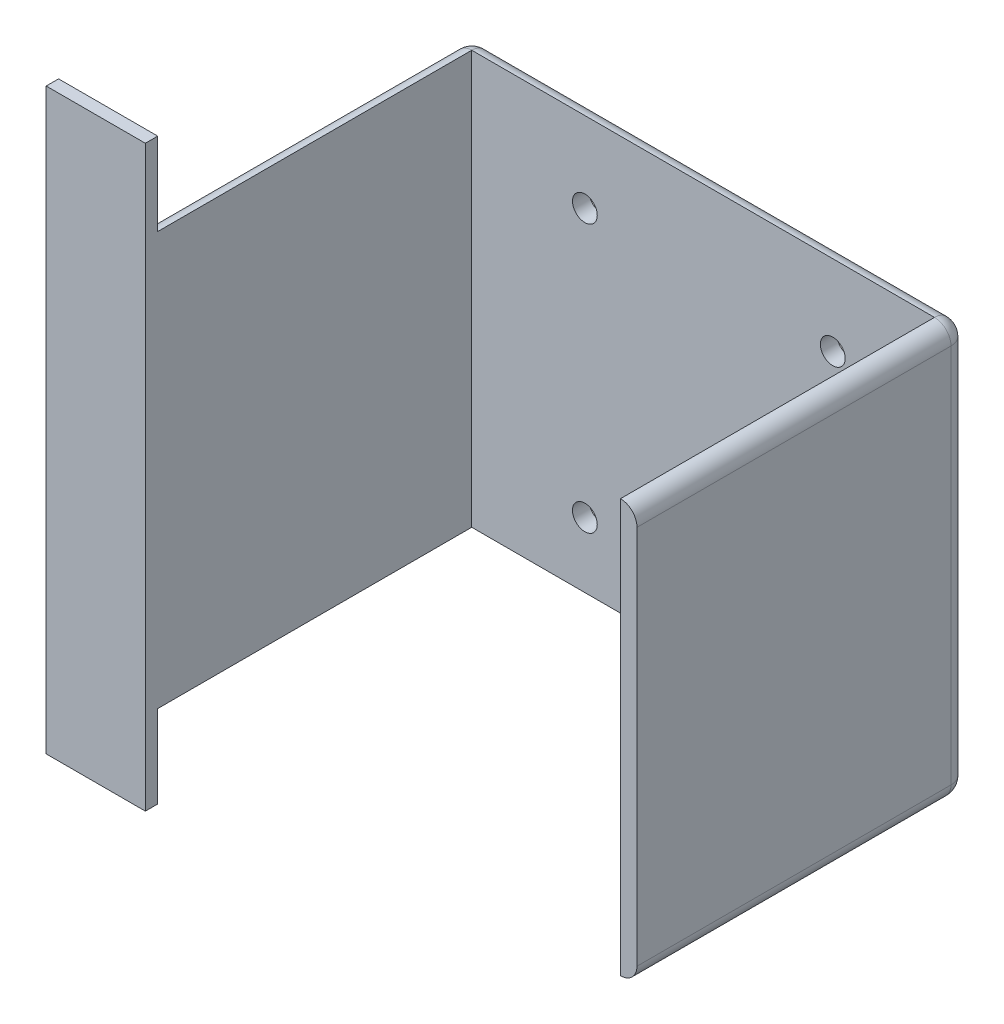
ISO-10303-21;
HEADER;
FILE_DESCRIPTION(('STEP AP214'),'2;1');
FILE_NAME('part.step','',(''),(''),'','','');
FILE_SCHEMA(('AUTOMOTIVE_DESIGN { 1 0 10303 214 1 1 1 1 }'));
ENDSEC;
DATA;
#1=APPLICATION_CONTEXT('core data for automotive mechanical design processes');
#2=APPLICATION_PROTOCOL_DEFINITION('international standard','automotive_design',2000,#1);
#3=PRODUCT_CONTEXT('',#1,'mechanical');
#4=PRODUCT('Part','Part','',(#3));
#5=PRODUCT_RELATED_PRODUCT_CATEGORY('part','',(#4));
#6=PRODUCT_DEFINITION_FORMATION('','',#4);
#7=PRODUCT_DEFINITION_CONTEXT('part definition',#1,'design');
#8=PRODUCT_DEFINITION('design','',#6,#7);
#9=PRODUCT_DEFINITION_SHAPE('','',#8);
#10=(LENGTH_UNIT() NAMED_UNIT(*) SI_UNIT(.MILLI.,.METRE.));
#11=(NAMED_UNIT(*) PLANE_ANGLE_UNIT() SI_UNIT($,.RADIAN.));
#12=(NAMED_UNIT(*) SI_UNIT($,.STERADIAN.) SOLID_ANGLE_UNIT());
#13=UNCERTAINTY_MEASURE_WITH_UNIT(LENGTH_MEASURE(1.E-05),#10,'distance_accuracy_value','');
#14=(GEOMETRIC_REPRESENTATION_CONTEXT(3) GLOBAL_UNCERTAINTY_ASSIGNED_CONTEXT((#13)) GLOBAL_UNIT_ASSIGNED_CONTEXT((#10,
#11,#12)) REPRESENTATION_CONTEXT('',''));
#15=CARTESIAN_POINT('',(0.,0.,0.));
#16=DIRECTION('',(0.,0.,1.));
#17=DIRECTION('',(1.,0.,0.));
#18=AXIS2_PLACEMENT_3D('',#15,#16,#17);
#19=CARTESIAN_POINT('',(0.,0.,41.5));
#20=DIRECTION('',(0.,0.,-1.));
#21=DIRECTION('',(-1.,0.,0.));
#22=AXIS2_PLACEMENT_3D('',#19,#20,#21);
#23=PLANE('',#22);
#24=DIRECTION('',(1.,0.,0.));
#25=VECTOR('',#24,1.);
#26=CARTESIAN_POINT('',(-40.,-35.,41.5));
#27=LINE('',#26,#25);
#28=CARTESIAN_POINT('',(-40.,-35.,41.5));
#29=VERTEX_POINT('',#28);
#30=CARTESIAN_POINT('',(-28.,-35.,41.5));
#31=VERTEX_POINT('',#30);
#32=EDGE_CURVE('E229',#29,#31,#27,.T.);
#33=ORIENTED_EDGE('',*,*,#32,.T.);
#34=DIRECTION('',(0.,-1.,0.));
#35=VECTOR('',#34,1.);
#36=CARTESIAN_POINT('',(-28.,0.,41.5));
#37=LINE('',#36,#35);
#38=CARTESIAN_POINT('',(-28.,35.,41.5));
#39=VERTEX_POINT('',#38);
#40=EDGE_CURVE('E226',#39,#31,#37,.T.);
#41=ORIENTED_EDGE('',*,*,#40,.F.);
#42=DIRECTION('',(1.,0.,0.));
#43=VECTOR('',#42,1.);
#44=CARTESIAN_POINT('',(-40.,35.,41.5));
#45=LINE('',#44,#43);
#46=CARTESIAN_POINT('',(-40.,35.,41.5));
#47=VERTEX_POINT('',#46);
#48=EDGE_CURVE('E232',#47,#39,#45,.T.);
#49=ORIENTED_EDGE('',*,*,#48,.F.);
#50=DIRECTION('',(0.,-1.,0.));
#51=VECTOR('',#50,1.);
#52=CARTESIAN_POINT('',(-40.,35.,41.5));
#53=LINE('',#52,#51);
#54=EDGE_CURVE('E236',#47,#29,#53,.T.);
#55=ORIENTED_EDGE('',*,*,#54,.T.);
#56=EDGE_LOOP('',(#33,#41,#49,#55));
#57=FACE_BOUND('',#56,.T.);
#58=ADVANCED_FACE('F34',(#57),#23,.F.);
#59=CARTESIAN_POINT('',(30.,25.,40.));
#60=DIRECTION('',(-1.,0.,0.));
#61=DIRECTION('',(0.,-1.,0.));
#62=AXIS2_PLACEMENT_3D('',#59,#60,#61);
#63=PLANE('',#62);
#64=DIRECTION('',(0.,0.,-1.));
#65=VECTOR('',#64,1.);
#66=CARTESIAN_POINT('',(30.,23.,40.));
#67=LINE('',#66,#65);
#68=CARTESIAN_POINT('',(30.,23.,2.));
#69=VERTEX_POINT('',#68);
#70=CARTESIAN_POINT('',(30.,23.,40.));
#71=VERTEX_POINT('',#70);
#72=EDGE_CURVE('E252',#69,#71,#67,.F.);
#73=ORIENTED_EDGE('',*,*,#72,.T.);
#74=DIRECTION('',(0.,1.,0.));
#75=VECTOR('',#74,1.);
#76=CARTESIAN_POINT('',(30.,35.,40.));
#77=LINE('',#76,#75);
#78=CARTESIAN_POINT('',(30.,-23.,40.));
#79=VERTEX_POINT('',#78);
#80=EDGE_CURVE('E144',#79,#71,#77,.T.);
#81=ORIENTED_EDGE('',*,*,#80,.F.);
#82=DIRECTION('',(0.,0.,-1.));
#83=VECTOR('',#82,1.);
#84=CARTESIAN_POINT('',(30.,-23.,40.));
#85=LINE('',#84,#83);
#86=CARTESIAN_POINT('',(30.,-23.,2.));
#87=VERTEX_POINT('',#86);
#88=EDGE_CURVE('E156',#79,#87,#85,.T.);
#89=ORIENTED_EDGE('',*,*,#88,.T.);
#90=DIRECTION('',(0.,1.,0.));
#91=VECTOR('',#90,1.);
#92=CARTESIAN_POINT('',(30.,25.,2.));
#93=LINE('',#92,#91);
#94=EDGE_CURVE('E261',#87,#69,#93,.T.);
#95=ORIENTED_EDGE('',*,*,#94,.T.);
#96=EDGE_LOOP('',(#73,#81,#89,#95));
#97=FACE_BOUND('',#96,.T.);
#98=ADVANCED_FACE('F333',(#97),#63,.F.);
#99=CARTESIAN_POINT('',(-30.,25.,40.));
#100=DIRECTION('',(1.,0.,0.));
#101=DIRECTION('',(0.,1.,0.));
#102=AXIS2_PLACEMENT_3D('',#99,#100,#101);
#103=PLANE('',#102);
#104=DIRECTION('',(0.,-1.,0.));
#105=VECTOR('',#104,1.);
#106=CARTESIAN_POINT('',(-30.,25.,2.));
#107=LINE('',#106,#105);
#108=CARTESIAN_POINT('',(-30.,23.,2.));
#109=VERTEX_POINT('',#108);
#110=CARTESIAN_POINT('',(-30.,-23.,2.));
#111=VERTEX_POINT('',#110);
#112=EDGE_CURVE('E59',#109,#111,#107,.T.);
#113=ORIENTED_EDGE('',*,*,#112,.T.);
#114=DIRECTION('',(0.,0.,-1.));
#115=VECTOR('',#114,1.);
#116=CARTESIAN_POINT('',(-30.,-23.,40.));
#117=LINE('',#116,#115);
#118=CARTESIAN_POINT('',(-30.,-23.,40.));
#119=VERTEX_POINT('',#118);
#120=EDGE_CURVE('E284',#111,#119,#117,.F.);
#121=ORIENTED_EDGE('',*,*,#120,.T.);
#122=DIRECTION('',(0.,-1.,0.));
#123=VECTOR('',#122,1.);
#124=CARTESIAN_POINT('',(-30.,25.,40.));
#125=LINE('',#124,#123);
#126=CARTESIAN_POINT('',(-30.,23.,40.));
#127=VERTEX_POINT('',#126);
#128=EDGE_CURVE('E249',#127,#119,#125,.T.);
#129=ORIENTED_EDGE('',*,*,#128,.F.);
#130=DIRECTION('',(0.,0.,-1.));
#131=VECTOR('',#130,1.);
#132=CARTESIAN_POINT('',(-30.,23.,40.));
#133=LINE('',#132,#131);
#134=EDGE_CURVE('E281',#127,#109,#133,.T.);
#135=ORIENTED_EDGE('',*,*,#134,.T.);
#136=EDGE_LOOP('',(#113,#121,#129,#135));
#137=FACE_BOUND('',#136,.T.);
#138=ADVANCED_FACE('F339',(#137),#103,.F.);
#139=CARTESIAN_POINT('',(0.,0.,0.));
#140=DIRECTION('',(0.,0.,1.));
#141=DIRECTION('',(1.,0.,0.));
#142=AXIS2_PLACEMENT_3D('',#139,#140,#141);
#143=PLANE('',#142);
#144=DIRECTION('',(-1.,0.,0.));
#145=VECTOR('',#144,1.);
#146=CARTESIAN_POINT('',(0.,23.,0.));
#147=LINE('',#146,#145);
#148=CARTESIAN_POINT('',(-28.,23.,0.));
#149=VERTEX_POINT('',#148);
#150=CARTESIAN_POINT('',(28.,23.,0.));
#151=VERTEX_POINT('',#150);
#152=EDGE_CURVE('E269',#149,#151,#147,.F.);
#153=ORIENTED_EDGE('',*,*,#152,.T.);
#154=DIRECTION('',(0.,1.,0.));
#155=VECTOR('',#154,1.);
#156=CARTESIAN_POINT('',(28.,0.,0.));
#157=LINE('',#156,#155);
#158=CARTESIAN_POINT('',(28.,-23.,0.));
#159=VERTEX_POINT('',#158);
#160=EDGE_CURVE('E271',#151,#159,#157,.F.);
#161=ORIENTED_EDGE('',*,*,#160,.T.);
#162=DIRECTION('',(1.,0.,0.));
#163=VECTOR('',#162,1.);
#164=CARTESIAN_POINT('',(0.,-23.,0.));
#165=LINE('',#164,#163);
#166=CARTESIAN_POINT('',(-28.,-23.,0.));
#167=VERTEX_POINT('',#166);
#168=EDGE_CURVE('E265',#159,#167,#165,.F.);
#169=ORIENTED_EDGE('',*,*,#168,.T.);
#170=DIRECTION('',(0.,-1.,0.));
#171=VECTOR('',#170,1.);
#172=CARTESIAN_POINT('',(-28.,0.,0.));
#173=LINE('',#172,#171);
#174=EDGE_CURVE('E267',#167,#149,#173,.F.);
#175=ORIENTED_EDGE('',*,*,#174,.T.);
#176=EDGE_LOOP('',(#153,#161,#169,#175));
#177=FACE_BOUND('',#176,.T.);
#178=CARTESIAN_POINT('',(15.6899999999982,15.2817000000195,0.));
#179=DIRECTION('',(0.,0.,-1.));
#180=DIRECTION('',(-1.,0.,0.));
#181=AXIS2_PLACEMENT_3D('',#178,#179,#180);
#182=CIRCLE('',#181,1.49999999999999);
#183=CARTESIAN_POINT('',(14.1899999999982,15.2817000000195,0.));
#184=VERTEX_POINT('',#183);
#185=EDGE_CURVE('E198',#184,#184,#182,.T.);
#186=ORIENTED_EDGE('',*,*,#185,.F.);
#187=EDGE_LOOP('',(#186));
#188=FACE_BOUND('',#187,.T.);
#189=CARTESIAN_POINT('',(-14.3100000000019,15.2817000000195,0.));
#190=DIRECTION('',(0.,0.,-1.));
#191=DIRECTION('',(-1.,0.,0.));
#192=AXIS2_PLACEMENT_3D('',#189,#190,#191);
#193=CIRCLE('',#192,1.49999999999999);
#194=CARTESIAN_POINT('',(-15.8100000000019,15.2817000000195,0.));
#195=VERTEX_POINT('',#194);
#196=EDGE_CURVE('E206',#195,#195,#193,.T.);
#197=ORIENTED_EDGE('',*,*,#196,.F.);
#198=EDGE_LOOP('',(#197));
#199=FACE_BOUND('',#198,.T.);
#200=CARTESIAN_POINT('',(-14.3100000000019,-17.1182999999805,0.));
#201=DIRECTION('',(0.,0.,-1.));
#202=DIRECTION('',(-1.,0.,0.));
#203=AXIS2_PLACEMENT_3D('',#200,#201,#202);
#204=CIRCLE('',#203,1.49999999999999);
#205=CARTESIAN_POINT('',(-15.8100000000019,-17.1182999999805,0.));
#206=VERTEX_POINT('',#205);
#207=EDGE_CURVE('E215',#206,#206,#204,.T.);
#208=ORIENTED_EDGE('',*,*,#207,.F.);
#209=EDGE_LOOP('',(#208));
#210=FACE_BOUND('',#209,.T.);
#211=CARTESIAN_POINT('',(15.6899999999982,-17.1182999999805,0.));
#212=DIRECTION('',(0.,0.,-1.));
#213=DIRECTION('',(-1.,0.,0.));
#214=AXIS2_PLACEMENT_3D('',#211,#212,#213);
#215=CIRCLE('',#214,1.49999999999999);
#216=CARTESIAN_POINT('',(14.1899999999982,-17.1182999999805,0.));
#217=VERTEX_POINT('',#216);
#218=EDGE_CURVE('E219',#217,#217,#215,.T.);
#219=ORIENTED_EDGE('',*,*,#218,.F.);
#220=EDGE_LOOP('',(#219));
#221=FACE_BOUND('',#220,.T.);
#222=ADVANCED_FACE('F320',(#177,#188,#199,#210,#221),#143,.F.);
#223=CARTESIAN_POINT('',(-40.,-35.,41.5));
#224=DIRECTION('',(0.,1.,0.));
#225=DIRECTION('',(0.,0.,1.));
#226=AXIS2_PLACEMENT_3D('',#223,#224,#225);
#227=PLANE('',#226);
#228=DIRECTION('',(1.,0.,0.));
#229=VECTOR('',#228,1.);
#230=CARTESIAN_POINT('',(-40.,-35.,40.));
#231=LINE('',#230,#229);
#232=CARTESIAN_POINT('',(-40.,-35.,40.));
#233=VERTEX_POINT('',#232);
#234=CARTESIAN_POINT('',(-28.,-35.,40.));
#235=VERTEX_POINT('',#234);
#236=EDGE_CURVE('E228',#233,#235,#231,.T.);
#237=ORIENTED_EDGE('',*,*,#236,.T.);
#238=DIRECTION('',(0.,0.,-1.));
#239=VECTOR('',#238,1.);
#240=CARTESIAN_POINT('',(-28.,-35.,1.99999999999999));
#241=LINE('',#240,#239);
#242=EDGE_CURVE('E143',#31,#235,#241,.T.);
#243=ORIENTED_EDGE('',*,*,#242,.F.);
#244=ORIENTED_EDGE('',*,*,#32,.F.);
#245=DIRECTION('',(0.,0.,-1.));
#246=VECTOR('',#245,1.);
#247=CARTESIAN_POINT('',(-40.,-35.,41.5));
#248=LINE('',#247,#246);
#249=EDGE_CURVE('E238',#29,#233,#248,.T.);
#250=ORIENTED_EDGE('',*,*,#249,.T.);
#251=EDGE_LOOP('',(#237,#243,#244,#250));
#252=FACE_BOUND('',#251,.T.);
#253=ADVANCED_FACE('F356',(#252),#227,.F.);
#254=CARTESIAN_POINT('',(-40.,35.,41.5));
#255=DIRECTION('',(0.,1.,0.));
#256=DIRECTION('',(0.,0.,1.));
#257=AXIS2_PLACEMENT_3D('',#254,#255,#256);
#258=PLANE('',#257);
#259=DIRECTION('',(0.,0.,-1.));
#260=VECTOR('',#259,1.);
#261=CARTESIAN_POINT('',(-28.,35.,1.99999999999999));
#262=LINE('',#261,#260);
#263=CARTESIAN_POINT('',(-28.,35.,40.));
#264=VERTEX_POINT('',#263);
#265=EDGE_CURVE('E613',#39,#264,#262,.T.);
#266=ORIENTED_EDGE('',*,*,#265,.T.);
#267=DIRECTION('',(1.,0.,0.));
#268=VECTOR('',#267,1.);
#269=CARTESIAN_POINT('',(-40.,35.,40.));
#270=LINE('',#269,#268);
#271=CARTESIAN_POINT('',(-40.,35.,40.));
#272=VERTEX_POINT('',#271);
#273=EDGE_CURVE('E241',#272,#264,#270,.T.);
#274=ORIENTED_EDGE('',*,*,#273,.F.);
#275=DIRECTION('',(0.,0.,-1.));
#276=VECTOR('',#275,1.);
#277=CARTESIAN_POINT('',(-40.,35.,41.5));
#278=LINE('',#277,#276);
#279=EDGE_CURVE('E247',#47,#272,#278,.T.);
#280=ORIENTED_EDGE('',*,*,#279,.F.);
#281=ORIENTED_EDGE('',*,*,#48,.T.);
#282=EDGE_LOOP('',(#266,#274,#280,#281));
#283=FACE_BOUND('',#282,.T.);
#284=ADVANCED_FACE('F352',(#283),#258,.T.);
#285=CARTESIAN_POINT('',(-40.,35.,41.5));
#286=DIRECTION('',(1.,0.,0.));
#287=DIRECTION('',(0.,1.,0.));
#288=AXIS2_PLACEMENT_3D('',#285,#286,#287);
#289=PLANE('',#288);
#290=DIRECTION('',(0.,-1.,0.));
#291=VECTOR('',#290,1.);
#292=CARTESIAN_POINT('',(-40.,35.,40.));
#293=LINE('',#292,#291);
#294=EDGE_CURVE('E233',#272,#233,#293,.T.);
#295=ORIENTED_EDGE('',*,*,#294,.T.);
#296=ORIENTED_EDGE('',*,*,#249,.F.);
#297=ORIENTED_EDGE('',*,*,#54,.F.);
#298=ORIENTED_EDGE('',*,*,#279,.T.);
#299=EDGE_LOOP('',(#295,#296,#297,#298));
#300=FACE_BOUND('',#299,.T.);
#301=ADVANCED_FACE('F348',(#300),#289,.F.);
#302=CARTESIAN_POINT('',(0.,0.,40.));
#303=DIRECTION('',(0.,0.,-1.));
#304=DIRECTION('',(-1.,0.,0.));
#305=AXIS2_PLACEMENT_3D('',#302,#303,#304);
#306=PLANE('',#305);
#307=DIRECTION('',(0.,1.,0.));
#308=VECTOR('',#307,1.);
#309=CARTESIAN_POINT('',(-28.,0.,40.));
#310=LINE('',#309,#308);
#311=CARTESIAN_POINT('',(-28.,-25.,40.));
#312=VERTEX_POINT('',#311);
#313=EDGE_CURVE('E167',#235,#312,#310,.T.);
#314=ORIENTED_EDGE('',*,*,#313,.F.);
#315=ORIENTED_EDGE('',*,*,#236,.F.);
#316=ORIENTED_EDGE('',*,*,#294,.F.);
#317=ORIENTED_EDGE('',*,*,#273,.T.);
#318=CARTESIAN_POINT('',(-28.,25.,40.));
#319=VERTEX_POINT('',#318);
#320=EDGE_CURVE('E210',#319,#264,#310,.T.);
#321=ORIENTED_EDGE('',*,*,#320,.F.);
#322=CARTESIAN_POINT('',(-28.,23.,40.));
#323=DIRECTION('',(0.,0.,-1.));
#324=DIRECTION('',(-1.,0.,0.));
#325=AXIS2_PLACEMENT_3D('',#322,#323,#324);
#326=CIRCLE('',#325,2.);
#327=EDGE_CURVE('E43',#319,#127,#326,.F.);
#328=ORIENTED_EDGE('',*,*,#327,.T.);
#329=ORIENTED_EDGE('',*,*,#128,.T.);
#330=CARTESIAN_POINT('',(-28.,-23.,40.));
#331=DIRECTION('',(0.,0.,-1.));
#332=DIRECTION('',(-1.,0.,0.));
#333=AXIS2_PLACEMENT_3D('',#330,#331,#332);
#334=CIRCLE('',#333,2.);
#335=EDGE_CURVE('E157',#119,#312,#334,.F.);
#336=ORIENTED_EDGE('',*,*,#335,.T.);
#337=EDGE_LOOP('',(#314,#315,#316,#317,#321,#328,#329,#336));
#338=FACE_BOUND('',#337,.T.);
#339=ADVANCED_FACE('F345',(#338),#306,.T.);
#340=CARTESIAN_POINT('',(28.,25.,40.));
#341=DIRECTION('',(-1.,0.,0.));
#342=DIRECTION('',(0.,-1.,0.));
#343=AXIS2_PLACEMENT_3D('',#340,#341,#342);
#344=PLANE('',#343);
#345=DIRECTION('',(0.,1.,0.));
#346=VECTOR('',#345,1.);
#347=CARTESIAN_POINT('',(28.,35.,40.));
#348=LINE('',#347,#346);
#349=CARTESIAN_POINT('',(28.,-25.,40.));
#350=VERTEX_POINT('',#349);
#351=CARTESIAN_POINT('',(28.,25.,40.));
#352=VERTEX_POINT('',#351);
#353=EDGE_CURVE('E136',#350,#352,#348,.T.);
#354=ORIENTED_EDGE('',*,*,#353,.T.);
#355=DIRECTION('',(0.,0.,-1.));
#356=VECTOR('',#355,1.);
#357=CARTESIAN_POINT('',(28.,25.,40.));
#358=LINE('',#357,#356);
#359=CARTESIAN_POINT('',(28.,25.,2.));
#360=VERTEX_POINT('',#359);
#361=EDGE_CURVE('E274',#352,#360,#358,.T.);
#362=ORIENTED_EDGE('',*,*,#361,.T.);
#363=DIRECTION('',(0.,1.,0.));
#364=VECTOR('',#363,1.);
#365=CARTESIAN_POINT('',(28.,25.,2.));
#366=LINE('',#365,#364);
#367=CARTESIAN_POINT('',(28.,-25.,2.));
#368=VERTEX_POINT('',#367);
#369=EDGE_CURVE('E51',#368,#360,#366,.T.);
#370=ORIENTED_EDGE('',*,*,#369,.F.);
#371=DIRECTION('',(0.,0.,-1.));
#372=VECTOR('',#371,1.);
#373=CARTESIAN_POINT('',(28.,-25.,40.));
#374=LINE('',#373,#372);
#375=EDGE_CURVE('E147',#368,#350,#374,.F.);
#376=ORIENTED_EDGE('',*,*,#375,.T.);
#377=EDGE_LOOP('',(#354,#362,#370,#376));
#378=FACE_BOUND('',#377,.T.);
#379=ADVANCED_FACE('F148',(#378),#344,.T.);
#380=CARTESIAN_POINT('',(-28.,25.,40.));
#381=DIRECTION('',(1.,0.,0.));
#382=DIRECTION('',(0.,1.,0.));
#383=AXIS2_PLACEMENT_3D('',#380,#381,#382);
#384=PLANE('',#383);
#385=ORIENTED_EDGE('',*,*,#40,.T.);
#386=ORIENTED_EDGE('',*,*,#242,.T.);
#387=ORIENTED_EDGE('',*,*,#313,.T.);
#388=DIRECTION('',(0.,0.,-1.));
#389=VECTOR('',#388,1.);
#390=CARTESIAN_POINT('',(-28.,-25.,40.));
#391=LINE('',#390,#389);
#392=CARTESIAN_POINT('',(-28.,-25.,1.99999999999999));
#393=VERTEX_POINT('',#392);
#394=EDGE_CURVE('E152',#312,#393,#391,.T.);
#395=ORIENTED_EDGE('',*,*,#394,.T.);
#396=DIRECTION('',(0.,-1.,0.));
#397=VECTOR('',#396,1.);
#398=CARTESIAN_POINT('',(-28.,25.,2.));
#399=LINE('',#398,#397);
#400=CARTESIAN_POINT('',(-28.,25.,1.99999999999999));
#401=VERTEX_POINT('',#400);
#402=EDGE_CURVE('E224',#401,#393,#399,.T.);
#403=ORIENTED_EDGE('',*,*,#402,.F.);
#404=DIRECTION('',(0.,0.,-1.));
#405=VECTOR('',#404,1.);
#406=CARTESIAN_POINT('',(-28.,25.,40.));
#407=LINE('',#406,#405);
#408=EDGE_CURVE('E279',#401,#319,#407,.F.);
#409=ORIENTED_EDGE('',*,*,#408,.T.);
#410=ORIENTED_EDGE('',*,*,#320,.T.);
#411=ORIENTED_EDGE('',*,*,#265,.F.);
#412=EDGE_LOOP('',(#385,#386,#387,#395,#403,#409,#410,#411));
#413=FACE_BOUND('',#412,.T.);
#414=ADVANCED_FACE('F290',(#413),#384,.T.);
#415=CARTESIAN_POINT('',(0.,0.,2.));
#416=DIRECTION('',(0.,0.,1.));
#417=DIRECTION('',(1.,0.,0.));
#418=AXIS2_PLACEMENT_3D('',#415,#416,#417);
#419=PLANE('',#418);
#420=CARTESIAN_POINT('',(15.6899999999982,15.2817000000195,2.));
#421=DIRECTION('',(0.,0.,1.));
#422=DIRECTION('',(1.,0.,0.));
#423=AXIS2_PLACEMENT_3D('',#420,#421,#422);
#424=CIRCLE('',#423,1.49999999999999);
#425=CARTESIAN_POINT('',(17.1899999999981,15.2817000000195,2.));
#426=VERTEX_POINT('',#425);
#427=EDGE_CURVE('E201',#426,#426,#424,.T.);
#428=ORIENTED_EDGE('',*,*,#427,.F.);
#429=EDGE_LOOP('',(#428));
#430=FACE_BOUND('',#429,.T.);
#431=CARTESIAN_POINT('',(-14.3100000000019,15.2817000000195,2.));
#432=DIRECTION('',(0.,0.,1.));
#433=DIRECTION('',(1.,0.,0.));
#434=AXIS2_PLACEMENT_3D('',#431,#432,#433);
#435=CIRCLE('',#434,1.49999999999999);
#436=CARTESIAN_POINT('',(-12.8100000000019,15.2817000000195,2.));
#437=VERTEX_POINT('',#436);
#438=EDGE_CURVE('E214',#437,#437,#435,.T.);
#439=ORIENTED_EDGE('',*,*,#438,.F.);
#440=EDGE_LOOP('',(#439));
#441=FACE_BOUND('',#440,.T.);
#442=CARTESIAN_POINT('',(-14.3100000000019,-17.1182999999805,2.));
#443=DIRECTION('',(0.,0.,1.));
#444=DIRECTION('',(1.,0.,0.));
#445=AXIS2_PLACEMENT_3D('',#442,#443,#444);
#446=CIRCLE('',#445,1.49999999999999);
#447=CARTESIAN_POINT('',(-12.8100000000019,-17.1182999999805,2.));
#448=VERTEX_POINT('',#447);
#449=EDGE_CURVE('E218',#448,#448,#446,.T.);
#450=ORIENTED_EDGE('',*,*,#449,.F.);
#451=EDGE_LOOP('',(#450));
#452=FACE_BOUND('',#451,.T.);
#453=CARTESIAN_POINT('',(15.6899999999982,-17.1182999999805,2.));
#454=DIRECTION('',(0.,0.,1.));
#455=DIRECTION('',(1.,0.,0.));
#456=AXIS2_PLACEMENT_3D('',#453,#454,#455);
#457=CIRCLE('',#456,1.49999999999999);
#458=CARTESIAN_POINT('',(17.1899999999981,-17.1182999999805,2.));
#459=VERTEX_POINT('',#458);
#460=EDGE_CURVE('E222',#459,#459,#457,.T.);
#461=ORIENTED_EDGE('',*,*,#460,.F.);
#462=EDGE_LOOP('',(#461));
#463=FACE_BOUND('',#462,.T.);
#464=ORIENTED_EDGE('',*,*,#369,.T.);
#465=DIRECTION('',(-1.,0.,0.));
#466=VECTOR('',#465,1.);
#467=CARTESIAN_POINT('',(-30.,25.,2.));
#468=LINE('',#467,#466);
#469=EDGE_CURVE('E276',#360,#401,#468,.T.);
#470=ORIENTED_EDGE('',*,*,#469,.T.);
#471=ORIENTED_EDGE('',*,*,#402,.T.);
#472=DIRECTION('',(1.,0.,0.));
#473=VECTOR('',#472,1.);
#474=CARTESIAN_POINT('',(-30.,-25.,2.));
#475=LINE('',#474,#473);
#476=EDGE_CURVE('E286',#393,#368,#475,.T.);
#477=ORIENTED_EDGE('',*,*,#476,.T.);
#478=EDGE_LOOP('',(#464,#470,#471,#477));
#479=FACE_BOUND('',#478,.T.);
#480=ADVANCED_FACE('F300',(#430,#441,#452,#463,#479),#419,.T.);
#481=CARTESIAN_POINT('',(15.6899999999982,-17.1182999999805,0.));
#482=DIRECTION('',(0.,0.,-1.));
#483=DIRECTION('',(-1.,0.,0.));
#484=AXIS2_PLACEMENT_3D('',#481,#482,#483);
#485=CYLINDRICAL_SURFACE('',#484,1.49999999999999);
#486=ORIENTED_EDGE('',*,*,#460,.T.);
#487=EDGE_LOOP('',(#486));
#488=FACE_BOUND('',#487,.T.);
#489=ORIENTED_EDGE('',*,*,#218,.T.);
#490=EDGE_LOOP('',(#489));
#491=FACE_BOUND('',#490,.T.);
#492=ADVANCED_FACE('F439',(#488,#491),#485,.F.);
#493=CARTESIAN_POINT('',(-14.3100000000019,-17.1182999999805,0.));
#494=DIRECTION('',(0.,0.,-1.));
#495=DIRECTION('',(-1.,0.,0.));
#496=AXIS2_PLACEMENT_3D('',#493,#494,#495);
#497=CYLINDRICAL_SURFACE('',#496,1.49999999999999);
#498=ORIENTED_EDGE('',*,*,#449,.T.);
#499=EDGE_LOOP('',(#498));
#500=FACE_BOUND('',#499,.T.);
#501=ORIENTED_EDGE('',*,*,#207,.T.);
#502=EDGE_LOOP('',(#501));
#503=FACE_BOUND('',#502,.T.);
#504=ADVANCED_FACE('F517',(#500,#503),#497,.F.);
#505=CARTESIAN_POINT('',(-14.3100000000019,15.2817000000195,0.));
#506=DIRECTION('',(0.,0.,-1.));
#507=DIRECTION('',(-1.,0.,0.));
#508=AXIS2_PLACEMENT_3D('',#505,#506,#507);
#509=CYLINDRICAL_SURFACE('',#508,1.49999999999999);
#510=ORIENTED_EDGE('',*,*,#438,.T.);
#511=EDGE_LOOP('',(#510));
#512=FACE_BOUND('',#511,.T.);
#513=ORIENTED_EDGE('',*,*,#196,.T.);
#514=EDGE_LOOP('',(#513));
#515=FACE_BOUND('',#514,.T.);
#516=ADVANCED_FACE('F507',(#512,#515),#509,.F.);
#517=CARTESIAN_POINT('',(15.6899999999982,15.2817000000195,0.));
#518=DIRECTION('',(0.,0.,-1.));
#519=DIRECTION('',(-1.,0.,0.));
#520=AXIS2_PLACEMENT_3D('',#517,#518,#519);
#521=CYLINDRICAL_SURFACE('',#520,1.49999999999999);
#522=ORIENTED_EDGE('',*,*,#427,.T.);
#523=EDGE_LOOP('',(#522));
#524=FACE_BOUND('',#523,.T.);
#525=ORIENTED_EDGE('',*,*,#185,.T.);
#526=EDGE_LOOP('',(#525));
#527=FACE_BOUND('',#526,.T.);
#528=ADVANCED_FACE('F500',(#524,#527),#521,.F.);
#529=CARTESIAN_POINT('',(-28.,-23.,40.));
#530=DIRECTION('',(0.,0.,-1.));
#531=DIRECTION('',(-1.,0.,0.));
#532=AXIS2_PLACEMENT_3D('',#529,#530,#531);
#533=CYLINDRICAL_SURFACE('',#532,2.);
#534=ORIENTED_EDGE('',*,*,#335,.F.);
#535=ORIENTED_EDGE('',*,*,#120,.F.);
#536=CARTESIAN_POINT('',(-28.,-23.,2.));
#537=DIRECTION('',(0.,0.,-1.));
#538=DIRECTION('',(-1.,0.,0.));
#539=AXIS2_PLACEMENT_3D('',#536,#537,#538);
#540=CIRCLE('',#539,2.);
#541=EDGE_CURVE('E192',#393,#111,#540,.T.);
#542=ORIENTED_EDGE('',*,*,#541,.F.);
#543=ORIENTED_EDGE('',*,*,#394,.F.);
#544=EDGE_LOOP('',(#534,#535,#542,#543));
#545=FACE_BOUND('',#544,.T.);
#546=ADVANCED_FACE('F36',(#545),#533,.T.);
#547=CARTESIAN_POINT('',(-28.,23.,40.));
#548=DIRECTION('',(0.,0.,-1.));
#549=DIRECTION('',(-1.,0.,0.));
#550=AXIS2_PLACEMENT_3D('',#547,#548,#549);
#551=CYLINDRICAL_SURFACE('',#550,2.);
#552=ORIENTED_EDGE('',*,*,#327,.F.);
#553=ORIENTED_EDGE('',*,*,#408,.F.);
#554=CARTESIAN_POINT('',(-28.,23.,2.));
#555=DIRECTION('',(0.,0.,-1.));
#556=DIRECTION('',(-1.,0.,0.));
#557=AXIS2_PLACEMENT_3D('',#554,#555,#556);
#558=CIRCLE('',#557,2.);
#559=EDGE_CURVE('E190',#109,#401,#558,.T.);
#560=ORIENTED_EDGE('',*,*,#559,.F.);
#561=ORIENTED_EDGE('',*,*,#134,.F.);
#562=EDGE_LOOP('',(#552,#553,#560,#561));
#563=FACE_BOUND('',#562,.T.);
#564=ADVANCED_FACE('F309',(#563),#551,.T.);
#565=CARTESIAN_POINT('',(-28.,25.,2.));
#566=DIRECTION('',(0.,-1.,0.));
#567=DIRECTION('',(1.,0.,0.));
#568=AXIS2_PLACEMENT_3D('',#565,#566,#567);
#569=CYLINDRICAL_SURFACE('',#568,2.);
#570=CARTESIAN_POINT('',(-28.,-23.,2.));
#571=DIRECTION('',(0.,-1.,0.));
#572=DIRECTION('',(0.,0.,-1.));
#573=AXIS2_PLACEMENT_3D('',#570,#571,#572);
#574=CIRCLE('',#573,2.);
#575=EDGE_CURVE('E38',#111,#167,#574,.T.);
#576=ORIENTED_EDGE('',*,*,#575,.F.);
#577=ORIENTED_EDGE('',*,*,#112,.F.);
#578=CARTESIAN_POINT('',(-28.,23.,2.));
#579=DIRECTION('',(0.,1.,0.));
#580=DIRECTION('',(0.,0.,1.));
#581=AXIS2_PLACEMENT_3D('',#578,#579,#580);
#582=CIRCLE('',#581,2.);
#583=EDGE_CURVE('E187',#149,#109,#582,.T.);
#584=ORIENTED_EDGE('',*,*,#583,.F.);
#585=ORIENTED_EDGE('',*,*,#174,.F.);
#586=EDGE_LOOP('',(#576,#577,#584,#585));
#587=FACE_BOUND('',#586,.T.);
#588=ADVANCED_FACE('F324',(#587),#569,.T.);
#589=CARTESIAN_POINT('',(-28.,-23.,2.));
#590=DIRECTION('',(0.,0.,1.));
#591=DIRECTION('',(1.,0.,0.));
#592=AXIS2_PLACEMENT_3D('',#589,#590,#591);
#593=SPHERICAL_SURFACE('',#592,2.);
#594=ORIENTED_EDGE('',*,*,#541,.T.);
#595=ORIENTED_EDGE('',*,*,#575,.T.);
#596=CARTESIAN_POINT('',(-28.,-23.,2.));
#597=DIRECTION('',(-1.,0.,0.));
#598=DIRECTION('',(0.,0.,1.));
#599=AXIS2_PLACEMENT_3D('',#596,#597,#598);
#600=CIRCLE('',#599,2.);
#601=EDGE_CURVE('E184',#393,#167,#600,.F.);
#602=ORIENTED_EDGE('',*,*,#601,.F.);
#603=EDGE_LOOP('',(#594,#595,#602));
#604=FACE_BOUND('',#603,.T.);
#605=ADVANCED_FACE('F295',(#604),#593,.T.);
#606=CARTESIAN_POINT('',(-28.,23.,2.));
#607=DIRECTION('',(0.,0.,1.));
#608=DIRECTION('',(1.,0.,0.));
#609=AXIS2_PLACEMENT_3D('',#606,#607,#608);
#610=SPHERICAL_SURFACE('',#609,2.);
#611=ORIENTED_EDGE('',*,*,#583,.T.);
#612=ORIENTED_EDGE('',*,*,#559,.T.);
#613=CARTESIAN_POINT('',(-28.,23.,2.));
#614=DIRECTION('',(-1.,0.,0.));
#615=DIRECTION('',(0.,0.,1.));
#616=AXIS2_PLACEMENT_3D('',#613,#614,#615);
#617=CIRCLE('',#616,2.);
#618=EDGE_CURVE('E181',#149,#401,#617,.F.);
#619=ORIENTED_EDGE('',*,*,#618,.F.);
#620=EDGE_LOOP('',(#611,#612,#619));
#621=FACE_BOUND('',#620,.T.);
#622=ADVANCED_FACE('F314',(#621),#610,.T.);
#623=CARTESIAN_POINT('',(-30.,-23.,2.));
#624=DIRECTION('',(1.,0.,0.));
#625=DIRECTION('',(0.,0.,-1.));
#626=AXIS2_PLACEMENT_3D('',#623,#624,#625);
#627=CYLINDRICAL_SURFACE('',#626,2.);
#628=ORIENTED_EDGE('',*,*,#601,.T.);
#629=ORIENTED_EDGE('',*,*,#168,.F.);
#630=CARTESIAN_POINT('',(28.,-23.,2.));
#631=DIRECTION('',(1.,0.,0.));
#632=DIRECTION('',(0.,0.,-1.));
#633=AXIS2_PLACEMENT_3D('',#630,#631,#632);
#634=CIRCLE('',#633,2.);
#635=EDGE_CURVE('E178',#368,#159,#634,.T.);
#636=ORIENTED_EDGE('',*,*,#635,.F.);
#637=ORIENTED_EDGE('',*,*,#476,.F.);
#638=EDGE_LOOP('',(#628,#629,#636,#637));
#639=FACE_BOUND('',#638,.T.);
#640=ADVANCED_FACE('F298',(#639),#627,.T.);
#641=CARTESIAN_POINT('',(28.,-23.,40.));
#642=DIRECTION('',(0.,0.,-1.));
#643=DIRECTION('',(-1.,0.,0.));
#644=AXIS2_PLACEMENT_3D('',#641,#642,#643);
#645=CYLINDRICAL_SURFACE('',#644,2.);
#646=CARTESIAN_POINT('',(28.,-23.,40.));
#647=DIRECTION('',(0.,0.,-1.));
#648=DIRECTION('',(-1.,0.,0.));
#649=AXIS2_PLACEMENT_3D('',#646,#647,#648);
#650=CIRCLE('',#649,2.);
#651=EDGE_CURVE('E139',#350,#79,#650,.F.);
#652=ORIENTED_EDGE('',*,*,#651,.F.);
#653=ORIENTED_EDGE('',*,*,#375,.F.);
#654=CARTESIAN_POINT('',(28.,-23.,2.));
#655=DIRECTION('',(0.,0.,-1.));
#656=DIRECTION('',(-1.,0.,0.));
#657=AXIS2_PLACEMENT_3D('',#654,#655,#656);
#658=CIRCLE('',#657,2.);
#659=EDGE_CURVE('E175',#87,#368,#658,.T.);
#660=ORIENTED_EDGE('',*,*,#659,.F.);
#661=ORIENTED_EDGE('',*,*,#88,.F.);
#662=EDGE_LOOP('',(#652,#653,#660,#661));
#663=FACE_BOUND('',#662,.T.);
#664=ADVANCED_FACE('F155',(#663),#645,.T.);
#665=CARTESIAN_POINT('',(28.,23.,40.));
#666=DIRECTION('',(0.,0.,-1.));
#667=DIRECTION('',(-1.,0.,0.));
#668=AXIS2_PLACEMENT_3D('',#665,#666,#667);
#669=CYLINDRICAL_SURFACE('',#668,2.);
#670=CARTESIAN_POINT('',(28.,23.,40.));
#671=DIRECTION('',(0.,0.,-1.));
#672=DIRECTION('',(-1.,0.,0.));
#673=AXIS2_PLACEMENT_3D('',#670,#671,#672);
#674=CIRCLE('',#673,2.);
#675=EDGE_CURVE('E11',#71,#352,#674,.F.);
#676=ORIENTED_EDGE('',*,*,#675,.F.);
#677=ORIENTED_EDGE('',*,*,#72,.F.);
#678=CARTESIAN_POINT('',(28.,23.,2.));
#679=DIRECTION('',(0.,0.,-1.));
#680=DIRECTION('',(-1.,0.,0.));
#681=AXIS2_PLACEMENT_3D('',#678,#679,#680);
#682=CIRCLE('',#681,2.);
#683=EDGE_CURVE('E172',#360,#69,#682,.T.);
#684=ORIENTED_EDGE('',*,*,#683,.F.);
#685=ORIENTED_EDGE('',*,*,#361,.F.);
#686=EDGE_LOOP('',(#676,#677,#684,#685));
#687=FACE_BOUND('',#686,.T.);
#688=ADVANCED_FACE('F379',(#687),#669,.T.);
#689=CARTESIAN_POINT('',(-30.,23.,2.));
#690=DIRECTION('',(-1.,0.,0.));
#691=DIRECTION('',(0.,0.,1.));
#692=AXIS2_PLACEMENT_3D('',#689,#690,#691);
#693=CYLINDRICAL_SURFACE('',#692,2.);
#694=ORIENTED_EDGE('',*,*,#618,.T.);
#695=ORIENTED_EDGE('',*,*,#469,.F.);
#696=CARTESIAN_POINT('',(28.,23.,2.));
#697=DIRECTION('',(1.,0.,0.));
#698=DIRECTION('',(0.,0.,-1.));
#699=AXIS2_PLACEMENT_3D('',#696,#697,#698);
#700=CIRCLE('',#699,2.);
#701=EDGE_CURVE('E169',#151,#360,#700,.T.);
#702=ORIENTED_EDGE('',*,*,#701,.F.);
#703=ORIENTED_EDGE('',*,*,#152,.F.);
#704=EDGE_LOOP('',(#694,#695,#702,#703));
#705=FACE_BOUND('',#704,.T.);
#706=ADVANCED_FACE('F317',(#705),#693,.T.);
#707=CARTESIAN_POINT('',(28.,-23.,2.));
#708=DIRECTION('',(0.,0.,1.));
#709=DIRECTION('',(1.,0.,0.));
#710=AXIS2_PLACEMENT_3D('',#707,#708,#709);
#711=SPHERICAL_SURFACE('',#710,2.);
#712=ORIENTED_EDGE('',*,*,#659,.T.);
#713=ORIENTED_EDGE('',*,*,#635,.T.);
#714=CARTESIAN_POINT('',(28.,-23.,2.));
#715=DIRECTION('',(0.,-1.,0.));
#716=DIRECTION('',(1.,0.,0.));
#717=AXIS2_PLACEMENT_3D('',#714,#715,#716);
#718=CIRCLE('',#717,2.);
#719=EDGE_CURVE('E166',#87,#159,#718,.F.);
#720=ORIENTED_EDGE('',*,*,#719,.F.);
#721=EDGE_LOOP('',(#712,#713,#720));
#722=FACE_BOUND('',#721,.T.);
#723=ADVANCED_FACE('F372',(#722),#711,.T.);
#724=CARTESIAN_POINT('',(28.,23.,2.));
#725=DIRECTION('',(0.,0.,1.));
#726=DIRECTION('',(1.,0.,0.));
#727=AXIS2_PLACEMENT_3D('',#724,#725,#726);
#728=SPHERICAL_SURFACE('',#727,2.);
#729=ORIENTED_EDGE('',*,*,#701,.T.);
#730=ORIENTED_EDGE('',*,*,#683,.T.);
#731=CARTESIAN_POINT('',(28.,23.,2.));
#732=DIRECTION('',(0.,1.,0.));
#733=DIRECTION('',(0.,0.,1.));
#734=AXIS2_PLACEMENT_3D('',#731,#732,#733);
#735=CIRCLE('',#734,2.);
#736=EDGE_CURVE('E164',#151,#69,#735,.F.);
#737=ORIENTED_EDGE('',*,*,#736,.F.);
#738=EDGE_LOOP('',(#729,#730,#737));
#739=FACE_BOUND('',#738,.T.);
#740=ADVANCED_FACE('F368',(#739),#728,.T.);
#741=CARTESIAN_POINT('',(28.,25.,2.));
#742=DIRECTION('',(0.,1.,0.));
#743=DIRECTION('',(-1.,0.,0.));
#744=AXIS2_PLACEMENT_3D('',#741,#742,#743);
#745=CYLINDRICAL_SURFACE('',#744,2.);
#746=ORIENTED_EDGE('',*,*,#719,.T.);
#747=ORIENTED_EDGE('',*,*,#160,.F.);
#748=ORIENTED_EDGE('',*,*,#736,.T.);
#749=ORIENTED_EDGE('',*,*,#94,.F.);
#750=EDGE_LOOP('',(#746,#747,#748,#749));
#751=FACE_BOUND('',#750,.T.);
#752=ADVANCED_FACE('F365',(#751),#745,.T.);
#753=CARTESIAN_POINT('',(-42.0160695840605,35.,40.));
#754=DIRECTION('',(0.,0.,-1.));
#755=DIRECTION('',(0.,1.,0.));
#756=AXIS2_PLACEMENT_3D('',#753,#754,#755);
#757=PLANE('',#756);
#758=ORIENTED_EDGE('',*,*,#651,.T.);
#759=ORIENTED_EDGE('',*,*,#80,.T.);
#760=ORIENTED_EDGE('',*,*,#675,.T.);
#761=ORIENTED_EDGE('',*,*,#353,.F.);
#762=EDGE_LOOP('',(#758,#759,#760,#761));
#763=FACE_BOUND('',#762,.T.);
#764=ADVANCED_FACE('F137',(#763),#757,.F.);
#765=CLOSED_SHELL('',(#58,#98,#138,#222,#253,#284,#301,#339,#379,#414,#480,#492,#504,#516,#528,
#546,#564,#588,#605,#622,#640,#664,#688,#706,#723,#740,#752,#764));
#766=MANIFOLD_SOLID_BREP('B2',#765);
#767=ADVANCED_BREP_SHAPE_REPRESENTATION('',(#18,#766),#14);
#768=SHAPE_DEFINITION_REPRESENTATION(#9,#767);
ENDSEC;
END-ISO-10303-21;
